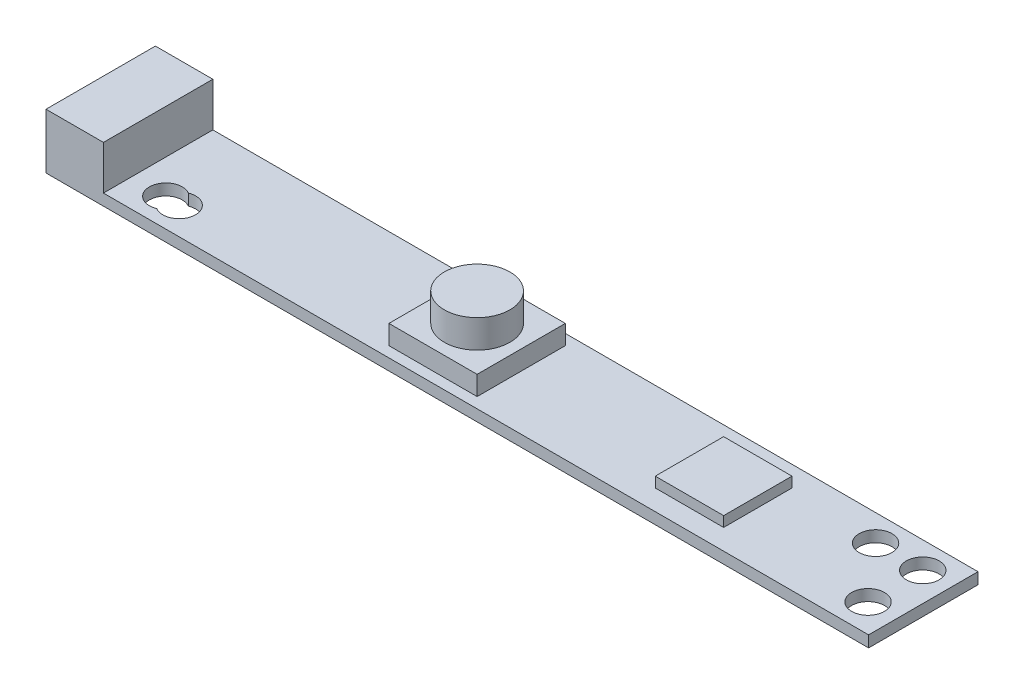
ISO-10303-21;
HEADER;
FILE_DESCRIPTION(('STEP AP214'),'2;1');
FILE_NAME('part.step','',(''),(''),'','','');
FILE_SCHEMA(('AUTOMOTIVE_DESIGN { 1 0 10303 214 1 1 1 1 }'));
ENDSEC;
DATA;
#1=APPLICATION_CONTEXT('core data for automotive mechanical design processes');
#2=APPLICATION_PROTOCOL_DEFINITION('international standard','automotive_design',2000,#1);
#3=PRODUCT_CONTEXT('',#1,'mechanical');
#4=PRODUCT('Part','Part','',(#3));
#5=PRODUCT_RELATED_PRODUCT_CATEGORY('part','',(#4));
#6=PRODUCT_DEFINITION_FORMATION('','',#4);
#7=PRODUCT_DEFINITION_CONTEXT('part definition',#1,'design');
#8=PRODUCT_DEFINITION('design','',#6,#7);
#9=PRODUCT_DEFINITION_SHAPE('','',#8);
#10=(LENGTH_UNIT() NAMED_UNIT(*) SI_UNIT(.MILLI.,.METRE.));
#11=(NAMED_UNIT(*) PLANE_ANGLE_UNIT() SI_UNIT($,.RADIAN.));
#12=(NAMED_UNIT(*) SI_UNIT($,.STERADIAN.) SOLID_ANGLE_UNIT());
#13=UNCERTAINTY_MEASURE_WITH_UNIT(LENGTH_MEASURE(1.E-05),#10,'distance_accuracy_value','');
#14=(GEOMETRIC_REPRESENTATION_CONTEXT(3) GLOBAL_UNCERTAINTY_ASSIGNED_CONTEXT((#13)) GLOBAL_UNIT_ASSIGNED_CONTEXT((#10,
#11,#12)) REPRESENTATION_CONTEXT('',''));
#15=CARTESIAN_POINT('',(0.,0.,0.));
#16=DIRECTION('',(0.,0.,1.));
#17=DIRECTION('',(1.,0.,0.));
#18=AXIS2_PLACEMENT_3D('',#15,#16,#17);
#19=CARTESIAN_POINT('',(0.,0.83,0.));
#20=DIRECTION('',(0.,-1.,0.));
#21=DIRECTION('',(0.,0.,-1.));
#22=AXIS2_PLACEMENT_3D('',#19,#20,#21);
#23=PLANE('',#22);
#24=CARTESIAN_POINT('',(24.52,0.83,-2.065));
#25=DIRECTION('',(0.,1.,0.));
#26=DIRECTION('',(0.,0.,1.));
#27=AXIS2_PLACEMENT_3D('',#24,#25,#26);
#28=CIRCLE('',#27,1.2);
#29=CARTESIAN_POINT('',(24.52,0.83,-0.865000000000001));
#30=VERTEX_POINT('',#29);
#31=EDGE_CURVE('E182',#30,#30,#28,.T.);
#32=ORIENTED_EDGE('',*,*,#31,.F.);
#33=EDGE_LOOP('',(#32));
#34=FACE_BOUND('',#33,.T.);
#35=CARTESIAN_POINT('',(27.97,0.83,-2.065));
#36=DIRECTION('',(0.,1.,0.));
#37=DIRECTION('',(0.,0.,1.));
#38=AXIS2_PLACEMENT_3D('',#35,#36,#37);
#39=CIRCLE('',#38,1.2);
#40=CARTESIAN_POINT('',(27.97,0.83,-0.865000000000001));
#41=VERTEX_POINT('',#40);
#42=EDGE_CURVE('E188',#41,#41,#39,.T.);
#43=ORIENTED_EDGE('',*,*,#42,.F.);
#44=EDGE_LOOP('',(#43));
#45=FACE_BOUND('',#44,.T.);
#46=CARTESIAN_POINT('',(27.97,0.83,1.935));
#47=DIRECTION('',(0.,1.,0.));
#48=DIRECTION('',(0.,0.,1.));
#49=AXIS2_PLACEMENT_3D('',#46,#47,#48);
#50=CIRCLE('',#49,1.2);
#51=CARTESIAN_POINT('',(27.97,0.83,3.135));
#52=VERTEX_POINT('',#51);
#53=EDGE_CURVE('E194',#52,#52,#50,.T.);
#54=ORIENTED_EDGE('',*,*,#53,.F.);
#55=EDGE_LOOP('',(#54));
#56=FACE_BOUND('',#55,.T.);
#57=CARTESIAN_POINT('',(-23.39,0.83,1.925));
#58=DIRECTION('',(0.,1.,0.));
#59=DIRECTION('',(0.,0.,1.));
#60=AXIS2_PLACEMENT_3D('',#57,#58,#59);
#61=CIRCLE('',#60,1.2);
#62=CARTESIAN_POINT('',(-22.7790324002308,0.83,0.892179303057769));
#63=VERTEX_POINT('',#62);
#64=CARTESIAN_POINT('',(-22.9409675997692,0.83,3.03782069694223));
#65=VERTEX_POINT('',#64);
#66=EDGE_CURVE('E200',#63,#65,#61,.T.);
#67=ORIENTED_EDGE('',*,*,#66,.F.);
#68=CARTESIAN_POINT('',(-22.33,0.83,2.005));
#69=DIRECTION('',(0.,1.,0.));
#70=DIRECTION('',(0.,0.,1.));
#71=AXIS2_PLACEMENT_3D('',#68,#69,#70);
#72=CIRCLE('',#71,1.2);
#73=EDGE_CURVE('E202',#65,#63,#72,.T.);
#74=ORIENTED_EDGE('',*,*,#73,.F.);
#75=EDGE_LOOP('',(#67,#74));
#76=FACE_BOUND('',#75,.T.);
#77=DIRECTION('',(1.,0.,0.));
#78=VECTOR('',#77,1.);
#79=CARTESIAN_POINT('',(0.,0.83,3.225));
#80=LINE('',#79,#78);
#81=CARTESIAN_POINT('',(-5.77499999999999,0.83,3.225));
#82=VERTEX_POINT('',#81);
#83=CARTESIAN_POINT('',(0.67500000000001,0.83,3.225));
#84=VERTEX_POINT('',#83);
#85=EDGE_CURVE('E250',#82,#84,#80,.T.);
#86=ORIENTED_EDGE('',*,*,#85,.F.);
#87=DIRECTION('',(0.,0.,1.));
#88=VECTOR('',#87,1.);
#89=CARTESIAN_POINT('',(-5.77499999999999,0.83,0.));
#90=LINE('',#89,#88);
#91=CARTESIAN_POINT('',(-5.77499999999999,0.83,-3.225));
#92=VERTEX_POINT('',#91);
#93=EDGE_CURVE('E247',#92,#82,#90,.T.);
#94=ORIENTED_EDGE('',*,*,#93,.F.);
#95=DIRECTION('',(1.,0.,0.));
#96=VECTOR('',#95,1.);
#97=CARTESIAN_POINT('',(0.,0.83,-3.225));
#98=LINE('',#97,#96);
#99=CARTESIAN_POINT('',(0.675000000000009,0.83,-3.225));
#100=VERTEX_POINT('',#99);
#101=EDGE_CURVE('E244',#92,#100,#98,.T.);
#102=ORIENTED_EDGE('',*,*,#101,.T.);
#103=DIRECTION('',(0.,0.,1.));
#104=VECTOR('',#103,1.);
#105=CARTESIAN_POINT('',(0.675000000000009,0.83,0.));
#106=LINE('',#105,#104);
#107=EDGE_CURVE('E232',#100,#84,#106,.T.);
#108=ORIENTED_EDGE('',*,*,#107,.T.);
#109=EDGE_LOOP('',(#86,#94,#102,#108));
#110=FACE_BOUND('',#109,.T.);
#111=DIRECTION('',(0.,0.,-1.));
#112=VECTOR('',#111,1.);
#113=CARTESIAN_POINT('',(-25.875,0.83,-4.));
#114=LINE('',#113,#112);
#115=CARTESIAN_POINT('',(-25.875,0.83,4.));
#116=VERTEX_POINT('',#115);
#117=CARTESIAN_POINT('',(-25.875,0.83,-4.));
#118=VERTEX_POINT('',#117);
#119=EDGE_CURVE('E208',#116,#118,#114,.T.);
#120=ORIENTED_EDGE('',*,*,#119,.F.);
#121=DIRECTION('',(1.,0.,0.));
#122=VECTOR('',#121,1.);
#123=CARTESIAN_POINT('',(-30.075,0.83,4.));
#124=LINE('',#123,#122);
#125=CARTESIAN_POINT('',(30.075,0.83,4.));
#126=VERTEX_POINT('',#125);
#127=EDGE_CURVE('E269',#116,#126,#124,.T.);
#128=ORIENTED_EDGE('',*,*,#127,.T.);
#129=DIRECTION('',(0.,0.,-1.));
#130=VECTOR('',#129,1.);
#131=CARTESIAN_POINT('',(30.075,0.83,4.));
#132=LINE('',#131,#130);
#133=CARTESIAN_POINT('',(30.075,0.83,-4.));
#134=VERTEX_POINT('',#133);
#135=EDGE_CURVE('E263',#126,#134,#132,.T.);
#136=ORIENTED_EDGE('',*,*,#135,.T.);
#137=DIRECTION('',(-1.,0.,0.));
#138=VECTOR('',#137,1.);
#139=CARTESIAN_POINT('',(-30.075,0.83,-4.));
#140=LINE('',#139,#138);
#141=EDGE_CURVE('E266',#134,#118,#140,.T.);
#142=ORIENTED_EDGE('',*,*,#141,.T.);
#143=EDGE_LOOP('',(#120,#128,#136,#142));
#144=FACE_BOUND('',#143,.T.);
#145=DIRECTION('',(1.,0.,0.));
#146=VECTOR('',#145,1.);
#147=CARTESIAN_POINT('',(12.975,0.83,2.5));
#148=LINE('',#147,#146);
#149=CARTESIAN_POINT('',(12.975,0.83,2.5));
#150=VERTEX_POINT('',#149);
#151=CARTESIAN_POINT('',(17.975,0.83,2.5));
#152=VERTEX_POINT('',#151);
#153=EDGE_CURVE('E52',#150,#152,#148,.T.);
#154=ORIENTED_EDGE('',*,*,#153,.F.);
#155=DIRECTION('',(0.,0.,1.));
#156=VECTOR('',#155,1.);
#157=CARTESIAN_POINT('',(12.975,0.83,2.5));
#158=LINE('',#157,#156);
#159=CARTESIAN_POINT('',(12.975,0.83,-2.5));
#160=VERTEX_POINT('',#159);
#161=EDGE_CURVE('E57',#160,#150,#158,.T.);
#162=ORIENTED_EDGE('',*,*,#161,.F.);
#163=DIRECTION('',(-1.,0.,0.));
#164=VECTOR('',#163,1.);
#165=CARTESIAN_POINT('',(12.975,0.83,-2.5));
#166=LINE('',#165,#164);
#167=CARTESIAN_POINT('',(17.975,0.83,-2.5));
#168=VERTEX_POINT('',#167);
#169=EDGE_CURVE('E147',#168,#160,#166,.T.);
#170=ORIENTED_EDGE('',*,*,#169,.F.);
#171=DIRECTION('',(0.,0.,-1.));
#172=VECTOR('',#171,1.);
#173=CARTESIAN_POINT('',(17.975,0.83,2.5));
#174=LINE('',#173,#172);
#175=EDGE_CURVE('E150',#152,#168,#174,.T.);
#176=ORIENTED_EDGE('',*,*,#175,.F.);
#177=EDGE_LOOP('',(#154,#162,#170,#176));
#178=FACE_BOUND('',#177,.T.);
#179=ADVANCED_FACE('F37',(#34,#45,#56,#76,#110,#144,#178),#23,.F.);
#180=CARTESIAN_POINT('',(30.075,0.83,4.));
#181=DIRECTION('',(-1.,0.,0.));
#182=DIRECTION('',(0.,0.,1.));
#183=AXIS2_PLACEMENT_3D('',#180,#181,#182);
#184=PLANE('',#183);
#185=DIRECTION('',(0.,0.,-1.));
#186=VECTOR('',#185,1.);
#187=CARTESIAN_POINT('',(30.075,0.,4.));
#188=LINE('',#187,#186);
#189=CARTESIAN_POINT('',(30.075,0.,4.));
#190=VERTEX_POINT('',#189);
#191=CARTESIAN_POINT('',(30.075,0.,-4.));
#192=VERTEX_POINT('',#191);
#193=EDGE_CURVE('E241',#190,#192,#188,.T.);
#194=ORIENTED_EDGE('',*,*,#193,.T.);
#195=DIRECTION('',(0.,-1.,0.));
#196=VECTOR('',#195,1.);
#197=CARTESIAN_POINT('',(30.075,0.83,-4.));
#198=LINE('',#197,#196);
#199=EDGE_CURVE('E287',#134,#192,#198,.T.);
#200=ORIENTED_EDGE('',*,*,#199,.F.);
#201=ORIENTED_EDGE('',*,*,#135,.F.);
#202=DIRECTION('',(0.,-1.,0.));
#203=VECTOR('',#202,1.);
#204=CARTESIAN_POINT('',(30.075,0.83,4.));
#205=LINE('',#204,#203);
#206=EDGE_CURVE('E271',#126,#190,#205,.T.);
#207=ORIENTED_EDGE('',*,*,#206,.T.);
#208=EDGE_LOOP('',(#194,#200,#201,#207));
#209=FACE_BOUND('',#208,.T.);
#210=ADVANCED_FACE('F39',(#209),#184,.F.);
#211=CARTESIAN_POINT('',(-30.075,0.83,-4.));
#212=DIRECTION('',(0.,0.,1.));
#213=DIRECTION('',(1.,0.,0.));
#214=AXIS2_PLACEMENT_3D('',#211,#212,#213);
#215=PLANE('',#214);
#216=DIRECTION('',(-1.,0.,0.));
#217=VECTOR('',#216,1.);
#218=CARTESIAN_POINT('',(-30.075,0.,-4.));
#219=LINE('',#218,#217);
#220=CARTESIAN_POINT('',(-30.075,0.,-4.));
#221=VERTEX_POINT('',#220);
#222=EDGE_CURVE('E274',#192,#221,#219,.T.);
#223=ORIENTED_EDGE('',*,*,#222,.T.);
#224=DIRECTION('',(0.,-1.,0.));
#225=VECTOR('',#224,1.);
#226=CARTESIAN_POINT('',(-30.075,0.83,-4.));
#227=LINE('',#226,#225);
#228=CARTESIAN_POINT('',(-30.075,4.04,-4.));
#229=VERTEX_POINT('',#228);
#230=EDGE_CURVE('E284',#229,#221,#227,.T.);
#231=ORIENTED_EDGE('',*,*,#230,.F.);
#232=DIRECTION('',(1.,0.,0.));
#233=VECTOR('',#232,1.);
#234=CARTESIAN_POINT('',(-30.075,4.04,-4.));
#235=LINE('',#234,#233);
#236=CARTESIAN_POINT('',(-25.875,4.04,-4.));
#237=VERTEX_POINT('',#236);
#238=EDGE_CURVE('E213',#229,#237,#235,.T.);
#239=ORIENTED_EDGE('',*,*,#238,.T.);
#240=DIRECTION('',(0.,-1.,0.));
#241=VECTOR('',#240,1.);
#242=CARTESIAN_POINT('',(-25.875,17.1154855984612,-4.));
#243=LINE('',#242,#241);
#244=EDGE_CURVE('E222',#237,#118,#243,.T.);
#245=ORIENTED_EDGE('',*,*,#244,.T.);
#246=ORIENTED_EDGE('',*,*,#141,.F.);
#247=ORIENTED_EDGE('',*,*,#199,.T.);
#248=EDGE_LOOP('',(#223,#231,#239,#245,#246,#247));
#249=FACE_BOUND('',#248,.T.);
#250=ADVANCED_FACE('F328',(#249),#215,.F.);
#251=CARTESIAN_POINT('',(-30.075,0.83,4.));
#252=DIRECTION('',(1.,0.,0.));
#253=DIRECTION('',(0.,0.,-1.));
#254=AXIS2_PLACEMENT_3D('',#251,#252,#253);
#255=PLANE('',#254);
#256=DIRECTION('',(0.,0.,1.));
#257=VECTOR('',#256,1.);
#258=CARTESIAN_POINT('',(-30.075,0.,4.));
#259=LINE('',#258,#257);
#260=CARTESIAN_POINT('',(-30.075,0.,4.));
#261=VERTEX_POINT('',#260);
#262=EDGE_CURVE('E276',#221,#261,#259,.T.);
#263=ORIENTED_EDGE('',*,*,#262,.T.);
#264=DIRECTION('',(0.,-1.,0.));
#265=VECTOR('',#264,1.);
#266=CARTESIAN_POINT('',(-30.075,0.83,4.));
#267=LINE('',#266,#265);
#268=CARTESIAN_POINT('',(-30.075,4.04,4.));
#269=VERTEX_POINT('',#268);
#270=EDGE_CURVE('E281',#269,#261,#267,.T.);
#271=ORIENTED_EDGE('',*,*,#270,.F.);
#272=DIRECTION('',(0.,0.,-1.));
#273=VECTOR('',#272,1.);
#274=CARTESIAN_POINT('',(-30.075,4.04,-4.));
#275=LINE('',#274,#273);
#276=EDGE_CURVE('E216',#269,#229,#275,.T.);
#277=ORIENTED_EDGE('',*,*,#276,.T.);
#278=ORIENTED_EDGE('',*,*,#230,.T.);
#279=EDGE_LOOP('',(#263,#271,#277,#278));
#280=FACE_BOUND('',#279,.T.);
#281=ADVANCED_FACE('F334',(#280),#255,.F.);
#282=CARTESIAN_POINT('',(-30.075,0.83,4.));
#283=DIRECTION('',(0.,0.,-1.));
#284=DIRECTION('',(-1.,0.,0.));
#285=AXIS2_PLACEMENT_3D('',#282,#283,#284);
#286=PLANE('',#285);
#287=DIRECTION('',(1.,0.,0.));
#288=VECTOR('',#287,1.);
#289=CARTESIAN_POINT('',(-30.075,0.,4.));
#290=LINE('',#289,#288);
#291=EDGE_CURVE('E267',#261,#190,#290,.T.);
#292=ORIENTED_EDGE('',*,*,#291,.T.);
#293=ORIENTED_EDGE('',*,*,#206,.F.);
#294=ORIENTED_EDGE('',*,*,#127,.F.);
#295=DIRECTION('',(0.,-1.,0.));
#296=VECTOR('',#295,1.);
#297=CARTESIAN_POINT('',(-25.875,17.1154855984612,4.));
#298=LINE('',#297,#296);
#299=CARTESIAN_POINT('',(-25.875,4.04,4.));
#300=VERTEX_POINT('',#299);
#301=EDGE_CURVE('E225',#300,#116,#298,.T.);
#302=ORIENTED_EDGE('',*,*,#301,.F.);
#303=DIRECTION('',(-1.,0.,0.));
#304=VECTOR('',#303,1.);
#305=CARTESIAN_POINT('',(-30.075,4.04,4.));
#306=LINE('',#305,#304);
#307=EDGE_CURVE('E212',#300,#269,#306,.T.);
#308=ORIENTED_EDGE('',*,*,#307,.T.);
#309=ORIENTED_EDGE('',*,*,#270,.T.);
#310=EDGE_LOOP('',(#292,#293,#294,#302,#308,#309));
#311=FACE_BOUND('',#310,.T.);
#312=ADVANCED_FACE('F321',(#311),#286,.F.);
#313=CARTESIAN_POINT('',(0.,0.,0.));
#314=DIRECTION('',(0.,-1.,0.));
#315=DIRECTION('',(0.,0.,-1.));
#316=AXIS2_PLACEMENT_3D('',#313,#314,#315);
#317=PLANE('',#316);
#318=CARTESIAN_POINT('',(24.52,0.,-2.065));
#319=DIRECTION('',(0.,-1.,0.));
#320=DIRECTION('',(0.,0.,-1.));
#321=AXIS2_PLACEMENT_3D('',#318,#319,#320);
#322=CIRCLE('',#321,1.2);
#323=CARTESIAN_POINT('',(24.52,0.,-3.265));
#324=VERTEX_POINT('',#323);
#325=EDGE_CURVE('E185',#324,#324,#322,.T.);
#326=ORIENTED_EDGE('',*,*,#325,.F.);
#327=EDGE_LOOP('',(#326));
#328=FACE_BOUND('',#327,.T.);
#329=CARTESIAN_POINT('',(27.97,0.,-2.065));
#330=DIRECTION('',(0.,-1.,0.));
#331=DIRECTION('',(0.,0.,-1.));
#332=AXIS2_PLACEMENT_3D('',#329,#330,#331);
#333=CIRCLE('',#332,1.2);
#334=CARTESIAN_POINT('',(27.97,0.,-3.265));
#335=VERTEX_POINT('',#334);
#336=EDGE_CURVE('E191',#335,#335,#333,.T.);
#337=ORIENTED_EDGE('',*,*,#336,.F.);
#338=EDGE_LOOP('',(#337));
#339=FACE_BOUND('',#338,.T.);
#340=CARTESIAN_POINT('',(27.97,0.,1.935));
#341=DIRECTION('',(0.,-1.,0.));
#342=DIRECTION('',(0.,0.,-1.));
#343=AXIS2_PLACEMENT_3D('',#340,#341,#342);
#344=CIRCLE('',#343,1.2);
#345=CARTESIAN_POINT('',(27.97,0.,0.735));
#346=VERTEX_POINT('',#345);
#347=EDGE_CURVE('E197',#346,#346,#344,.T.);
#348=ORIENTED_EDGE('',*,*,#347,.F.);
#349=EDGE_LOOP('',(#348));
#350=FACE_BOUND('',#349,.T.);
#351=CARTESIAN_POINT('',(-23.39,0.,1.925));
#352=DIRECTION('',(0.,-1.,0.));
#353=DIRECTION('',(0.,0.,-1.));
#354=AXIS2_PLACEMENT_3D('',#351,#352,#353);
#355=CIRCLE('',#354,1.2);
#356=CARTESIAN_POINT('',(-22.9409675997692,0.,3.03782069694223));
#357=VERTEX_POINT('',#356);
#358=CARTESIAN_POINT('',(-22.7790324002308,0.,0.892179303057768));
#359=VERTEX_POINT('',#358);
#360=EDGE_CURVE('E293',#357,#359,#355,.T.);
#361=ORIENTED_EDGE('',*,*,#360,.F.);
#362=CARTESIAN_POINT('',(-22.33,0.,2.005));
#363=DIRECTION('',(0.,-1.,0.));
#364=DIRECTION('',(0.,0.,-1.));
#365=AXIS2_PLACEMENT_3D('',#362,#363,#364);
#366=CIRCLE('',#365,1.2);
#367=EDGE_CURVE('E205',#359,#357,#366,.T.);
#368=ORIENTED_EDGE('',*,*,#367,.F.);
#369=EDGE_LOOP('',(#361,#368));
#370=FACE_BOUND('',#369,.T.);
#371=ORIENTED_EDGE('',*,*,#193,.F.);
#372=ORIENTED_EDGE('',*,*,#291,.F.);
#373=ORIENTED_EDGE('',*,*,#262,.F.);
#374=ORIENTED_EDGE('',*,*,#222,.F.);
#375=EDGE_LOOP('',(#371,#372,#373,#374));
#376=FACE_BOUND('',#375,.T.);
#377=ADVANCED_FACE('F303',(#328,#339,#350,#370,#376),#317,.T.);
#378=CARTESIAN_POINT('',(0.,13.6016774773065,3.225));
#379=DIRECTION('',(0.,0.,-1.));
#380=DIRECTION('',(-1.,0.,0.));
#381=AXIS2_PLACEMENT_3D('',#378,#379,#380);
#382=PLANE('',#381);
#383=DIRECTION('',(0.,-1.,0.));
#384=VECTOR('',#383,1.);
#385=CARTESIAN_POINT('',(0.67500000000001,13.6016774773065,3.225));
#386=LINE('',#385,#384);
#387=CARTESIAN_POINT('',(0.67500000000001,2.24,3.225));
#388=VERTEX_POINT('',#387);
#389=EDGE_CURVE('E252',#388,#84,#386,.T.);
#390=ORIENTED_EDGE('',*,*,#389,.F.);
#391=DIRECTION('',(-1.,0.,0.));
#392=VECTOR('',#391,1.);
#393=CARTESIAN_POINT('',(0.,2.24,3.225));
#394=LINE('',#393,#392);
#395=CARTESIAN_POINT('',(-5.77499999999999,2.24,3.225));
#396=VERTEX_POINT('',#395);
#397=EDGE_CURVE('E237',#388,#396,#394,.T.);
#398=ORIENTED_EDGE('',*,*,#397,.T.);
#399=DIRECTION('',(0.,-1.,0.));
#400=VECTOR('',#399,1.);
#401=CARTESIAN_POINT('',(-5.77499999999999,13.6016774773065,3.225));
#402=LINE('',#401,#400);
#403=EDGE_CURVE('E255',#396,#82,#402,.T.);
#404=ORIENTED_EDGE('',*,*,#403,.T.);
#405=ORIENTED_EDGE('',*,*,#85,.T.);
#406=EDGE_LOOP('',(#390,#398,#404,#405));
#407=FACE_BOUND('',#406,.T.);
#408=ADVANCED_FACE('F337',(#407),#382,.F.);
#409=CARTESIAN_POINT('',(-5.77499999999999,13.6016774773065,0.));
#410=DIRECTION('',(1.,0.,0.));
#411=DIRECTION('',(0.,0.,-1.));
#412=AXIS2_PLACEMENT_3D('',#409,#410,#411);
#413=PLANE('',#412);
#414=ORIENTED_EDGE('',*,*,#403,.F.);
#415=DIRECTION('',(0.,0.,-1.));
#416=VECTOR('',#415,1.);
#417=CARTESIAN_POINT('',(-5.77499999999999,2.24,0.));
#418=LINE('',#417,#416);
#419=CARTESIAN_POINT('',(-5.77499999999999,2.24,-3.225));
#420=VERTEX_POINT('',#419);
#421=EDGE_CURVE('E233',#396,#420,#418,.T.);
#422=ORIENTED_EDGE('',*,*,#421,.T.);
#423=DIRECTION('',(0.,-1.,0.));
#424=VECTOR('',#423,1.);
#425=CARTESIAN_POINT('',(-5.77499999999999,13.6016774773065,-3.225));
#426=LINE('',#425,#424);
#427=EDGE_CURVE('E257',#420,#92,#426,.T.);
#428=ORIENTED_EDGE('',*,*,#427,.T.);
#429=ORIENTED_EDGE('',*,*,#93,.T.);
#430=EDGE_LOOP('',(#414,#422,#428,#429));
#431=FACE_BOUND('',#430,.T.);
#432=ADVANCED_FACE('F344',(#431),#413,.F.);
#433=CARTESIAN_POINT('',(0.,13.6016774773065,-3.225));
#434=DIRECTION('',(0.,0.,-1.));
#435=DIRECTION('',(-1.,0.,0.));
#436=AXIS2_PLACEMENT_3D('',#433,#434,#435);
#437=PLANE('',#436);
#438=DIRECTION('',(-1.,0.,0.));
#439=VECTOR('',#438,1.);
#440=CARTESIAN_POINT('',(0.,2.24,-3.225));
#441=LINE('',#440,#439);
#442=CARTESIAN_POINT('',(0.675000000000009,2.24,-3.225));
#443=VERTEX_POINT('',#442);
#444=EDGE_CURVE('E236',#443,#420,#441,.T.);
#445=ORIENTED_EDGE('',*,*,#444,.F.);
#446=DIRECTION('',(0.,-1.,0.));
#447=VECTOR('',#446,1.);
#448=CARTESIAN_POINT('',(0.675000000000009,13.6016774773065,-3.225));
#449=LINE('',#448,#447);
#450=EDGE_CURVE('E259',#443,#100,#449,.T.);
#451=ORIENTED_EDGE('',*,*,#450,.T.);
#452=ORIENTED_EDGE('',*,*,#101,.F.);
#453=ORIENTED_EDGE('',*,*,#427,.F.);
#454=EDGE_LOOP('',(#445,#451,#452,#453));
#455=FACE_BOUND('',#454,.T.);
#456=ADVANCED_FACE('F376',(#455),#437,.T.);
#457=CARTESIAN_POINT('',(0.675000000000009,13.6016774773065,0.));
#458=DIRECTION('',(1.,0.,0.));
#459=DIRECTION('',(0.,0.,-1.));
#460=AXIS2_PLACEMENT_3D('',#457,#458,#459);
#461=PLANE('',#460);
#462=DIRECTION('',(0.,0.,-1.));
#463=VECTOR('',#462,1.);
#464=CARTESIAN_POINT('',(0.675000000000009,2.24,0.));
#465=LINE('',#464,#463);
#466=EDGE_CURVE('E239',#388,#443,#465,.T.);
#467=ORIENTED_EDGE('',*,*,#466,.F.);
#468=ORIENTED_EDGE('',*,*,#389,.T.);
#469=ORIENTED_EDGE('',*,*,#107,.F.);
#470=ORIENTED_EDGE('',*,*,#450,.F.);
#471=EDGE_LOOP('',(#467,#468,#469,#470));
#472=FACE_BOUND('',#471,.T.);
#473=ADVANCED_FACE('F386',(#472),#461,.T.);
#474=CARTESIAN_POINT('',(0.,2.24,0.));
#475=DIRECTION('',(0.,-1.,0.));
#476=DIRECTION('',(0.,0.,-1.));
#477=AXIS2_PLACEMENT_3D('',#474,#475,#476);
#478=PLANE('',#477);
#479=CARTESIAN_POINT('',(-2.54999999999999,2.24,0.));
#480=DIRECTION('',(0.,-1.,0.));
#481=DIRECTION('',(0.,0.,-1.));
#482=AXIS2_PLACEMENT_3D('',#479,#480,#481);
#483=CIRCLE('',#482,2.4);
#484=CARTESIAN_POINT('',(-2.54999999999999,2.24,-2.4));
#485=VERTEX_POINT('',#484);
#486=EDGE_CURVE('E290',#485,#485,#483,.F.);
#487=ORIENTED_EDGE('',*,*,#486,.F.);
#488=EDGE_LOOP('',(#487));
#489=FACE_BOUND('',#488,.T.);
#490=ORIENTED_EDGE('',*,*,#466,.T.);
#491=ORIENTED_EDGE('',*,*,#444,.T.);
#492=ORIENTED_EDGE('',*,*,#421,.F.);
#493=ORIENTED_EDGE('',*,*,#397,.F.);
#494=EDGE_LOOP('',(#490,#491,#492,#493));
#495=FACE_BOUND('',#494,.T.);
#496=ADVANCED_FACE('F396',(#489,#495),#478,.F.);
#497=CARTESIAN_POINT('',(-2.54999999999999,15.3882250993909,0.));
#498=DIRECTION('',(0.,-1.,0.));
#499=DIRECTION('',(0.,0.,-1.));
#500=AXIS2_PLACEMENT_3D('',#497,#498,#499);
#501=CYLINDRICAL_SURFACE('',#500,2.4);
#502=CARTESIAN_POINT('',(-2.54999999999999,4.3,0.));
#503=DIRECTION('',(0.,-1.,0.));
#504=DIRECTION('',(0.,0.,-1.));
#505=AXIS2_PLACEMENT_3D('',#502,#503,#504);
#506=CIRCLE('',#505,2.4);
#507=CARTESIAN_POINT('',(-2.54999999999999,4.3,-2.4));
#508=VERTEX_POINT('',#507);
#509=EDGE_CURVE('E219',#508,#508,#506,.T.);
#510=ORIENTED_EDGE('',*,*,#509,.T.);
#511=EDGE_LOOP('',(#510));
#512=FACE_BOUND('',#511,.T.);
#513=ORIENTED_EDGE('',*,*,#486,.T.);
#514=EDGE_LOOP('',(#513));
#515=FACE_BOUND('',#514,.T.);
#516=ADVANCED_FACE('F405',(#512,#515),#501,.T.);
#517=CARTESIAN_POINT('',(0.,4.3,0.));
#518=DIRECTION('',(0.,-1.,0.));
#519=DIRECTION('',(0.,0.,-1.));
#520=AXIS2_PLACEMENT_3D('',#517,#518,#519);
#521=PLANE('',#520);
#522=ORIENTED_EDGE('',*,*,#509,.F.);
#523=EDGE_LOOP('',(#522));
#524=FACE_BOUND('',#523,.T.);
#525=ADVANCED_FACE('F415',(#524),#521,.F.);
#526=CARTESIAN_POINT('',(-25.875,17.1154855984612,-4.));
#527=DIRECTION('',(-1.,0.,0.));
#528=DIRECTION('',(0.,0.,1.));
#529=AXIS2_PLACEMENT_3D('',#526,#527,#528);
#530=PLANE('',#529);
#531=ORIENTED_EDGE('',*,*,#244,.F.);
#532=DIRECTION('',(0.,0.,1.));
#533=VECTOR('',#532,1.);
#534=CARTESIAN_POINT('',(-25.875,4.04,-4.));
#535=LINE('',#534,#533);
#536=EDGE_CURVE('E209',#237,#300,#535,.T.);
#537=ORIENTED_EDGE('',*,*,#536,.T.);
#538=ORIENTED_EDGE('',*,*,#301,.T.);
#539=ORIENTED_EDGE('',*,*,#119,.T.);
#540=EDGE_LOOP('',(#531,#537,#538,#539));
#541=FACE_BOUND('',#540,.T.);
#542=ADVANCED_FACE('F319',(#541),#530,.F.);
#543=CARTESIAN_POINT('',(0.,4.04,0.));
#544=DIRECTION('',(0.,-1.,0.));
#545=DIRECTION('',(0.,0.,-1.));
#546=AXIS2_PLACEMENT_3D('',#543,#544,#545);
#547=PLANE('',#546);
#548=ORIENTED_EDGE('',*,*,#307,.F.);
#549=ORIENTED_EDGE('',*,*,#536,.F.);
#550=ORIENTED_EDGE('',*,*,#238,.F.);
#551=ORIENTED_EDGE('',*,*,#276,.F.);
#552=EDGE_LOOP('',(#548,#549,#550,#551));
#553=FACE_BOUND('',#552,.T.);
#554=ADVANCED_FACE('F332',(#553),#547,.F.);
#555=CARTESIAN_POINT('',(-22.33,0.83,2.005));
#556=DIRECTION('',(0.,1.,0.));
#557=DIRECTION('',(0.,0.,1.));
#558=AXIS2_PLACEMENT_3D('',#555,#556,#557);
#559=CYLINDRICAL_SURFACE('',#558,1.2);
#560=ORIENTED_EDGE('',*,*,#367,.T.);
#561=DIRECTION('',(0.,1.,0.));
#562=VECTOR('',#561,1.);
#563=CARTESIAN_POINT('',(-22.9409675997692,0.415,3.03782069694223));
#564=LINE('',#563,#562);
#565=EDGE_CURVE('E12',#357,#65,#564,.T.);
#566=ORIENTED_EDGE('',*,*,#565,.T.);
#567=ORIENTED_EDGE('',*,*,#73,.T.);
#568=DIRECTION('',(0.,1.,0.));
#569=VECTOR('',#568,1.);
#570=CARTESIAN_POINT('',(-22.7790324002308,0.415,0.892179303057769));
#571=LINE('',#570,#569);
#572=EDGE_CURVE('E45',#63,#359,#571,.F.);
#573=ORIENTED_EDGE('',*,*,#572,.T.);
#574=EDGE_LOOP('',(#560,#566,#567,#573));
#575=FACE_BOUND('',#574,.T.);
#576=ADVANCED_FACE('F297',(#575),#559,.F.);
#577=CARTESIAN_POINT('',(-23.39,0.83,1.925));
#578=DIRECTION('',(0.,1.,0.));
#579=DIRECTION('',(0.,0.,1.));
#580=AXIS2_PLACEMENT_3D('',#577,#578,#579);
#581=CYLINDRICAL_SURFACE('',#580,1.2);
#582=ORIENTED_EDGE('',*,*,#360,.T.);
#583=ORIENTED_EDGE('',*,*,#572,.F.);
#584=ORIENTED_EDGE('',*,*,#66,.T.);
#585=ORIENTED_EDGE('',*,*,#565,.F.);
#586=EDGE_LOOP('',(#582,#583,#584,#585));
#587=FACE_BOUND('',#586,.T.);
#588=ADVANCED_FACE('F305',(#587),#581,.F.);
#589=CARTESIAN_POINT('',(27.97,0.83,1.935));
#590=DIRECTION('',(0.,1.,0.));
#591=DIRECTION('',(0.,0.,1.));
#592=AXIS2_PLACEMENT_3D('',#589,#590,#591);
#593=CYLINDRICAL_SURFACE('',#592,1.2);
#594=ORIENTED_EDGE('',*,*,#53,.T.);
#595=EDGE_LOOP('',(#594));
#596=FACE_BOUND('',#595,.T.);
#597=ORIENTED_EDGE('',*,*,#347,.T.);
#598=EDGE_LOOP('',(#597));
#599=FACE_BOUND('',#598,.T.);
#600=ADVANCED_FACE('F479',(#596,#599),#593,.F.);
#601=CARTESIAN_POINT('',(27.97,0.83,-2.065));
#602=DIRECTION('',(0.,1.,0.));
#603=DIRECTION('',(0.,0.,1.));
#604=AXIS2_PLACEMENT_3D('',#601,#602,#603);
#605=CYLINDRICAL_SURFACE('',#604,1.2);
#606=ORIENTED_EDGE('',*,*,#42,.T.);
#607=EDGE_LOOP('',(#606));
#608=FACE_BOUND('',#607,.T.);
#609=ORIENTED_EDGE('',*,*,#336,.T.);
#610=EDGE_LOOP('',(#609));
#611=FACE_BOUND('',#610,.T.);
#612=ADVANCED_FACE('F488',(#608,#611),#605,.F.);
#613=CARTESIAN_POINT('',(24.52,0.83,-2.065));
#614=DIRECTION('',(0.,1.,0.));
#615=DIRECTION('',(0.,0.,1.));
#616=AXIS2_PLACEMENT_3D('',#613,#614,#615);
#617=CYLINDRICAL_SURFACE('',#616,1.2);
#618=ORIENTED_EDGE('',*,*,#31,.T.);
#619=EDGE_LOOP('',(#618));
#620=FACE_BOUND('',#619,.T.);
#621=ORIENTED_EDGE('',*,*,#325,.T.);
#622=EDGE_LOOP('',(#621));
#623=FACE_BOUND('',#622,.T.);
#624=ADVANCED_FACE('F498',(#620,#623),#617,.F.);
#625=CARTESIAN_POINT('',(12.975,10.2310678118655,2.5));
#626=DIRECTION('',(0.,0.,-1.));
#627=DIRECTION('',(-1.,0.,0.));
#628=AXIS2_PLACEMENT_3D('',#625,#626,#627);
#629=PLANE('',#628);
#630=DIRECTION('',(0.,-1.,0.));
#631=VECTOR('',#630,1.);
#632=CARTESIAN_POINT('',(17.975,10.2310678118655,2.5));
#633=LINE('',#632,#631);
#634=CARTESIAN_POINT('',(17.975,1.58,2.5));
#635=VERTEX_POINT('',#634);
#636=EDGE_CURVE('E167',#635,#152,#633,.T.);
#637=ORIENTED_EDGE('',*,*,#636,.F.);
#638=DIRECTION('',(-1.,0.,0.));
#639=VECTOR('',#638,1.);
#640=CARTESIAN_POINT('',(12.975,1.58,2.5));
#641=LINE('',#640,#639);
#642=CARTESIAN_POINT('',(12.975,1.58,2.5));
#643=VERTEX_POINT('',#642);
#644=EDGE_CURVE('E162',#635,#643,#641,.T.);
#645=ORIENTED_EDGE('',*,*,#644,.T.);
#646=DIRECTION('',(0.,-1.,0.));
#647=VECTOR('',#646,1.);
#648=CARTESIAN_POINT('',(12.975,10.2310678118655,2.5));
#649=LINE('',#648,#647);
#650=EDGE_CURVE('E176',#643,#150,#649,.T.);
#651=ORIENTED_EDGE('',*,*,#650,.T.);
#652=ORIENTED_EDGE('',*,*,#153,.T.);
#653=EDGE_LOOP('',(#637,#645,#651,#652));
#654=FACE_BOUND('',#653,.T.);
#655=ADVANCED_FACE('F507',(#654),#629,.F.);
#656=CARTESIAN_POINT('',(12.975,10.2310678118655,2.5));
#657=DIRECTION('',(1.,0.,0.));
#658=DIRECTION('',(0.,0.,-1.));
#659=AXIS2_PLACEMENT_3D('',#656,#657,#658);
#660=PLANE('',#659);
#661=ORIENTED_EDGE('',*,*,#650,.F.);
#662=DIRECTION('',(0.,0.,-1.));
#663=VECTOR('',#662,1.);
#664=CARTESIAN_POINT('',(12.975,1.58,2.5));
#665=LINE('',#664,#663);
#666=CARTESIAN_POINT('',(12.975,1.58,-2.5));
#667=VERTEX_POINT('',#666);
#668=EDGE_CURVE('E181',#643,#667,#665,.T.);
#669=ORIENTED_EDGE('',*,*,#668,.T.);
#670=DIRECTION('',(0.,-1.,0.));
#671=VECTOR('',#670,1.);
#672=CARTESIAN_POINT('',(12.975,10.2310678118655,-2.5));
#673=LINE('',#672,#671);
#674=EDGE_CURVE('E163',#667,#160,#673,.T.);
#675=ORIENTED_EDGE('',*,*,#674,.T.);
#676=ORIENTED_EDGE('',*,*,#161,.T.);
#677=EDGE_LOOP('',(#661,#669,#675,#676));
#678=FACE_BOUND('',#677,.T.);
#679=ADVANCED_FACE('F523',(#678),#660,.F.);
#680=CARTESIAN_POINT('',(12.975,10.2310678118655,-2.5));
#681=DIRECTION('',(0.,0.,1.));
#682=DIRECTION('',(1.,0.,0.));
#683=AXIS2_PLACEMENT_3D('',#680,#681,#682);
#684=PLANE('',#683);
#685=ORIENTED_EDGE('',*,*,#674,.F.);
#686=DIRECTION('',(1.,0.,0.));
#687=VECTOR('',#686,1.);
#688=CARTESIAN_POINT('',(12.975,1.58,-2.5));
#689=LINE('',#688,#687);
#690=CARTESIAN_POINT('',(17.975,1.58,-2.5));
#691=VERTEX_POINT('',#690);
#692=EDGE_CURVE('E159',#667,#691,#689,.T.);
#693=ORIENTED_EDGE('',*,*,#692,.T.);
#694=DIRECTION('',(0.,-1.,0.));
#695=VECTOR('',#694,1.);
#696=CARTESIAN_POINT('',(17.975,10.2310678118655,-2.5));
#697=LINE('',#696,#695);
#698=EDGE_CURVE('E157',#691,#168,#697,.T.);
#699=ORIENTED_EDGE('',*,*,#698,.T.);
#700=ORIENTED_EDGE('',*,*,#169,.T.);
#701=EDGE_LOOP('',(#685,#693,#699,#700));
#702=FACE_BOUND('',#701,.T.);
#703=ADVANCED_FACE('F158',(#702),#684,.F.);
#704=CARTESIAN_POINT('',(17.975,10.2310678118655,2.5));
#705=DIRECTION('',(-1.,0.,0.));
#706=DIRECTION('',(0.,0.,1.));
#707=AXIS2_PLACEMENT_3D('',#704,#705,#706);
#708=PLANE('',#707);
#709=ORIENTED_EDGE('',*,*,#698,.F.);
#710=DIRECTION('',(0.,0.,1.));
#711=VECTOR('',#710,1.);
#712=CARTESIAN_POINT('',(17.975,1.58,2.5));
#713=LINE('',#712,#711);
#714=EDGE_CURVE('E170',#691,#635,#713,.T.);
#715=ORIENTED_EDGE('',*,*,#714,.T.);
#716=ORIENTED_EDGE('',*,*,#636,.T.);
#717=ORIENTED_EDGE('',*,*,#175,.T.);
#718=EDGE_LOOP('',(#709,#715,#716,#717));
#719=FACE_BOUND('',#718,.T.);
#720=ADVANCED_FACE('F165',(#719),#708,.F.);
#721=CARTESIAN_POINT('',(0.,1.58,0.));
#722=DIRECTION('',(0.,-1.,0.));
#723=DIRECTION('',(0.,0.,-1.));
#724=AXIS2_PLACEMENT_3D('',#721,#722,#723);
#725=PLANE('',#724);
#726=ORIENTED_EDGE('',*,*,#692,.F.);
#727=ORIENTED_EDGE('',*,*,#668,.F.);
#728=ORIENTED_EDGE('',*,*,#644,.F.);
#729=ORIENTED_EDGE('',*,*,#714,.F.);
#730=EDGE_LOOP('',(#726,#727,#728,#729));
#731=FACE_BOUND('',#730,.T.);
#732=ADVANCED_FACE('F550',(#731),#725,.F.);
#733=CLOSED_SHELL('',(#179,#210,#250,#281,#312,#377,#408,#432,#456,#473,#496,#516,#525,#542,
#554,#576,#588,#600,#612,#624,#655,#679,#703,#720,#732));
#734=MANIFOLD_SOLID_BREP('B2',#733);
#735=ADVANCED_BREP_SHAPE_REPRESENTATION('',(#18,#734),#14);
#736=SHAPE_DEFINITION_REPRESENTATION(#9,#735);
ENDSEC;
END-ISO-10303-21;
